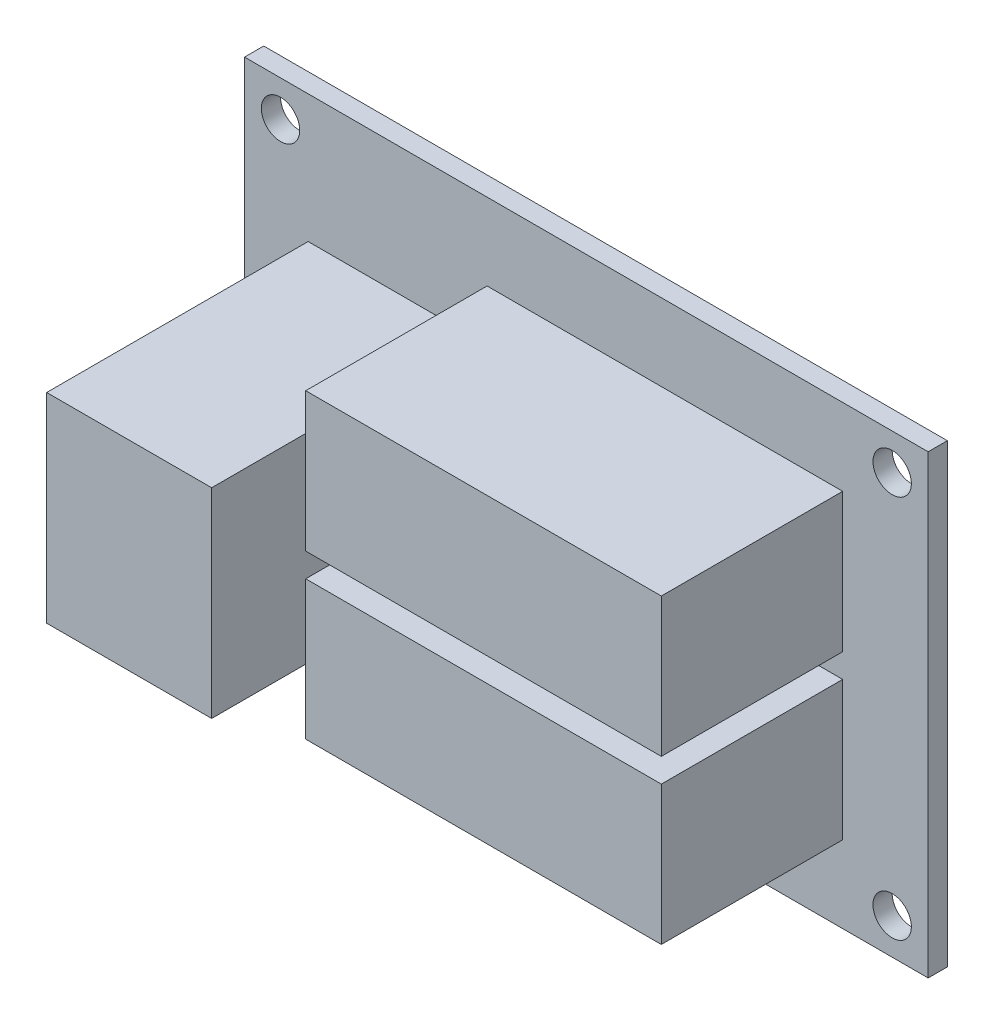
ISO-10303-21;
HEADER;
FILE_DESCRIPTION(('STEP AP214'),'2;1');
FILE_NAME('part.step','',(''),(''),'','','');
FILE_SCHEMA(('AUTOMOTIVE_DESIGN { 1 0 10303 214 1 1 1 1 }'));
ENDSEC;
DATA;
#1=APPLICATION_CONTEXT('core data for automotive mechanical design processes');
#2=APPLICATION_PROTOCOL_DEFINITION('international standard','automotive_design',2000,#1);
#3=PRODUCT_CONTEXT('',#1,'mechanical');
#4=PRODUCT('Part','Part','',(#3));
#5=PRODUCT_RELATED_PRODUCT_CATEGORY('part','',(#4));
#6=PRODUCT_DEFINITION_FORMATION('','',#4);
#7=PRODUCT_DEFINITION_CONTEXT('part definition',#1,'design');
#8=PRODUCT_DEFINITION('design','',#6,#7);
#9=PRODUCT_DEFINITION_SHAPE('','',#8);
#10=(LENGTH_UNIT() NAMED_UNIT(*) SI_UNIT(.MILLI.,.METRE.));
#11=(NAMED_UNIT(*) PLANE_ANGLE_UNIT() SI_UNIT($,.RADIAN.));
#12=(NAMED_UNIT(*) SI_UNIT($,.STERADIAN.) SOLID_ANGLE_UNIT());
#13=UNCERTAINTY_MEASURE_WITH_UNIT(LENGTH_MEASURE(1.E-05),#10,'distance_accuracy_value','');
#14=(GEOMETRIC_REPRESENTATION_CONTEXT(3) GLOBAL_UNCERTAINTY_ASSIGNED_CONTEXT((#13)) GLOBAL_UNIT_ASSIGNED_CONTEXT((#10,
#11,#12)) REPRESENTATION_CONTEXT('',''));
#15=CARTESIAN_POINT('',(0.,0.,0.));
#16=DIRECTION('',(0.,0.,1.));
#17=DIRECTION('',(1.,0.,0.));
#18=AXIS2_PLACEMENT_3D('',#15,#16,#17);
#19=CARTESIAN_POINT('',(0.,0.,1.6));
#20=DIRECTION('',(0.,0.,1.));
#21=DIRECTION('',(1.,0.,0.));
#22=AXIS2_PLACEMENT_3D('',#19,#20,#21);
#23=PLANE('',#22);
#24=CARTESIAN_POINT('',(-25.5,16.,1.6));
#25=DIRECTION('',(0.,0.,1.));
#26=DIRECTION('',(1.,0.,0.));
#27=AXIS2_PLACEMENT_3D('',#24,#25,#26);
#28=CIRCLE('',#27,1.6);
#29=CARTESIAN_POINT('',(-23.9,16.,1.6));
#30=VERTEX_POINT('',#29);
#31=EDGE_CURVE('E205',#30,#30,#28,.T.);
#32=ORIENTED_EDGE('',*,*,#31,.F.);
#33=EDGE_LOOP('',(#32));
#34=FACE_BOUND('',#33,.T.);
#35=CARTESIAN_POINT('',(-25.5,-16.,1.6));
#36=DIRECTION('',(0.,0.,1.));
#37=DIRECTION('',(1.,0.,0.));
#38=AXIS2_PLACEMENT_3D('',#35,#36,#37);
#39=CIRCLE('',#38,1.6);
#40=CARTESIAN_POINT('',(-23.9,-16.,1.6));
#41=VERTEX_POINT('',#40);
#42=EDGE_CURVE('E217',#41,#41,#39,.T.);
#43=ORIENTED_EDGE('',*,*,#42,.F.);
#44=EDGE_LOOP('',(#43));
#45=FACE_BOUND('',#44,.T.);
#46=DIRECTION('',(0.,1.,0.));
#47=VECTOR('',#46,1.);
#48=CARTESIAN_POINT('',(28.5,19.,1.6));
#49=LINE('',#48,#47);
#50=CARTESIAN_POINT('',(28.5,-19.,1.6));
#51=VERTEX_POINT('',#50);
#52=CARTESIAN_POINT('',(28.5,19.,1.6));
#53=VERTEX_POINT('',#52);
#54=EDGE_CURVE('E223',#51,#53,#49,.T.);
#55=ORIENTED_EDGE('',*,*,#54,.T.);
#56=DIRECTION('',(-1.,0.,0.));
#57=VECTOR('',#56,1.);
#58=CARTESIAN_POINT('',(-28.5,19.,1.6));
#59=LINE('',#58,#57);
#60=CARTESIAN_POINT('',(-28.5,19.,1.6));
#61=VERTEX_POINT('',#60);
#62=EDGE_CURVE('E226',#53,#61,#59,.T.);
#63=ORIENTED_EDGE('',*,*,#62,.T.);
#64=DIRECTION('',(0.,-1.,0.));
#65=VECTOR('',#64,1.);
#66=CARTESIAN_POINT('',(-28.5,19.,1.6));
#67=LINE('',#66,#65);
#68=CARTESIAN_POINT('',(-28.5,-19.,1.6));
#69=VERTEX_POINT('',#68);
#70=EDGE_CURVE('E229',#61,#69,#67,.T.);
#71=ORIENTED_EDGE('',*,*,#70,.T.);
#72=DIRECTION('',(1.,0.,0.));
#73=VECTOR('',#72,1.);
#74=CARTESIAN_POINT('',(-28.5,-19.,1.6));
#75=LINE('',#74,#73);
#76=EDGE_CURVE('E231',#69,#51,#75,.T.);
#77=ORIENTED_EDGE('',*,*,#76,.T.);
#78=EDGE_LOOP('',(#55,#63,#71,#77));
#79=FACE_BOUND('',#78,.T.);
#80=CARTESIAN_POINT('',(25.5,-16.,1.6));
#81=DIRECTION('',(0.,0.,1.));
#82=DIRECTION('',(1.,0.,0.));
#83=AXIS2_PLACEMENT_3D('',#80,#81,#82);
#84=CIRCLE('',#83,1.6);
#85=CARTESIAN_POINT('',(27.1,-16.,1.6));
#86=VERTEX_POINT('',#85);
#87=EDGE_CURVE('E211',#86,#86,#84,.T.);
#88=ORIENTED_EDGE('',*,*,#87,.F.);
#89=EDGE_LOOP('',(#88));
#90=FACE_BOUND('',#89,.T.);
#91=CARTESIAN_POINT('',(25.5,16.,1.6));
#92=DIRECTION('',(0.,0.,1.));
#93=DIRECTION('',(1.,0.,0.));
#94=AXIS2_PLACEMENT_3D('',#91,#92,#93);
#95=CIRCLE('',#94,1.6);
#96=CARTESIAN_POINT('',(27.1,16.,1.6));
#97=VERTEX_POINT('',#96);
#98=EDGE_CURVE('E197',#97,#97,#95,.T.);
#99=ORIENTED_EDGE('',*,*,#98,.F.);
#100=EDGE_LOOP('',(#99));
#101=FACE_BOUND('',#100,.T.);
#102=DIRECTION('',(1.,0.,0.));
#103=VECTOR('',#102,1.);
#104=CARTESIAN_POINT('',(21.374051794384,-12.5820715026048,1.6));
#105=LINE('',#104,#103);
#106=CARTESIAN_POINT('',(-8.27632162363964,-12.5820715026048,1.6));
#107=VERTEX_POINT('',#106);
#108=CARTESIAN_POINT('',(21.374051794384,-12.5820715026048,1.6));
#109=VERTEX_POINT('',#108);
#110=EDGE_CURVE('E193',#107,#109,#105,.T.);
#111=ORIENTED_EDGE('',*,*,#110,.F.);
#112=DIRECTION('',(0.,-1.,0.));
#113=VECTOR('',#112,1.);
#114=CARTESIAN_POINT('',(-8.27632162363964,-1.,1.6));
#115=LINE('',#114,#113);
#116=CARTESIAN_POINT('',(-8.27632162363964,-1.,1.6));
#117=VERTEX_POINT('',#116);
#118=EDGE_CURVE('E173',#117,#107,#115,.T.);
#119=ORIENTED_EDGE('',*,*,#118,.F.);
#120=DIRECTION('',(-1.,0.,0.));
#121=VECTOR('',#120,1.);
#122=CARTESIAN_POINT('',(21.374051794384,-1.,1.6));
#123=LINE('',#122,#121);
#124=CARTESIAN_POINT('',(21.374051794384,-1.,1.6));
#125=VERTEX_POINT('',#124);
#126=EDGE_CURVE('E187',#125,#117,#123,.T.);
#127=ORIENTED_EDGE('',*,*,#126,.F.);
#128=DIRECTION('',(0.,1.,0.));
#129=VECTOR('',#128,1.);
#130=CARTESIAN_POINT('',(21.374051794384,-1.,1.6));
#131=LINE('',#130,#129);
#132=EDGE_CURVE('E190',#109,#125,#131,.T.);
#133=ORIENTED_EDGE('',*,*,#132,.F.);
#134=EDGE_LOOP('',(#111,#119,#127,#133));
#135=FACE_BOUND('',#134,.T.);
#136=DIRECTION('',(1.,0.,0.));
#137=VECTOR('',#136,1.);
#138=CARTESIAN_POINT('',(21.374051794384,1.,1.6));
#139=LINE('',#138,#137);
#140=CARTESIAN_POINT('',(-8.27632162363964,1.,1.6));
#141=VERTEX_POINT('',#140);
#142=CARTESIAN_POINT('',(21.374051794384,1.,1.6));
#143=VERTEX_POINT('',#142);
#144=EDGE_CURVE('E285',#141,#143,#139,.T.);
#145=ORIENTED_EDGE('',*,*,#144,.F.);
#146=DIRECTION('',(0.,-1.,0.));
#147=VECTOR('',#146,1.);
#148=CARTESIAN_POINT('',(-8.27632162363964,12.5820715026048,1.6));
#149=LINE('',#148,#147);
#150=CARTESIAN_POINT('',(-8.27632162363964,12.5820715026048,1.6));
#151=VERTEX_POINT('',#150);
#152=EDGE_CURVE('E181',#151,#141,#149,.T.);
#153=ORIENTED_EDGE('',*,*,#152,.F.);
#154=DIRECTION('',(-1.,0.,0.));
#155=VECTOR('',#154,1.);
#156=CARTESIAN_POINT('',(21.374051794384,12.5820715026048,1.6));
#157=LINE('',#156,#155);
#158=CARTESIAN_POINT('',(21.374051794384,12.5820715026048,1.6));
#159=VERTEX_POINT('',#158);
#160=EDGE_CURVE('E322',#159,#151,#157,.T.);
#161=ORIENTED_EDGE('',*,*,#160,.F.);
#162=DIRECTION('',(0.,1.,0.));
#163=VECTOR('',#162,1.);
#164=CARTESIAN_POINT('',(21.374051794384,12.5820715026048,1.6));
#165=LINE('',#164,#163);
#166=EDGE_CURVE('E325',#143,#159,#165,.T.);
#167=ORIENTED_EDGE('',*,*,#166,.F.);
#168=EDGE_LOOP('',(#145,#153,#161,#167));
#169=FACE_BOUND('',#168,.T.);
#170=DIRECTION('',(-1.,0.,0.));
#171=VECTOR('',#170,1.);
#172=CARTESIAN_POINT('',(-23.1993644123557,8.33110830490331,1.6));
#173=LINE('',#172,#171);
#174=CARTESIAN_POINT('',(-9.44182928087719,8.33110830490331,1.6));
#175=VERTEX_POINT('',#174);
#176=CARTESIAN_POINT('',(-23.1993644123557,8.33110830490331,1.6));
#177=VERTEX_POINT('',#176);
#178=EDGE_CURVE('E289',#175,#177,#173,.T.);
#179=ORIENTED_EDGE('',*,*,#178,.F.);
#180=DIRECTION('',(0.,1.,0.));
#181=VECTOR('',#180,1.);
#182=CARTESIAN_POINT('',(-9.44182928087719,8.33110830490331,1.6));
#183=LINE('',#182,#181);
#184=CARTESIAN_POINT('',(-9.44182928087718,-8.3311083049033,1.6));
#185=VERTEX_POINT('',#184);
#186=EDGE_CURVE('E292',#185,#175,#183,.T.);
#187=ORIENTED_EDGE('',*,*,#186,.F.);
#188=DIRECTION('',(1.,0.,0.));
#189=VECTOR('',#188,1.);
#190=CARTESIAN_POINT('',(-23.1993644123557,-8.3311083049033,1.6));
#191=LINE('',#190,#189);
#192=CARTESIAN_POINT('',(-23.1993644123557,-8.3311083049033,1.6));
#193=VERTEX_POINT('',#192);
#194=EDGE_CURVE('E299',#193,#185,#191,.T.);
#195=ORIENTED_EDGE('',*,*,#194,.F.);
#196=DIRECTION('',(0.,-1.,0.));
#197=VECTOR('',#196,1.);
#198=CARTESIAN_POINT('',(-23.1993644123557,8.33110830490331,1.6));
#199=LINE('',#198,#197);
#200=EDGE_CURVE('E294',#177,#193,#199,.T.);
#201=ORIENTED_EDGE('',*,*,#200,.F.);
#202=EDGE_LOOP('',(#179,#187,#195,#201));
#203=FACE_BOUND('',#202,.T.);
#204=ADVANCED_FACE('F43',(#34,#45,#79,#90,#101,#135,#169,#203),#23,.T.);
#205=CARTESIAN_POINT('',(0.,0.,0.));
#206=DIRECTION('',(0.,0.,1.));
#207=DIRECTION('',(1.,0.,0.));
#208=AXIS2_PLACEMENT_3D('',#205,#206,#207);
#209=PLANE('',#208);
#210=DIRECTION('',(0.,1.,0.));
#211=VECTOR('',#210,1.);
#212=CARTESIAN_POINT('',(28.5,19.,0.));
#213=LINE('',#212,#211);
#214=CARTESIAN_POINT('',(28.5,-19.,0.));
#215=VERTEX_POINT('',#214);
#216=CARTESIAN_POINT('',(28.5,19.,0.));
#217=VERTEX_POINT('',#216);
#218=EDGE_CURVE('E220',#215,#217,#213,.T.);
#219=ORIENTED_EDGE('',*,*,#218,.F.);
#220=DIRECTION('',(1.,0.,0.));
#221=VECTOR('',#220,1.);
#222=CARTESIAN_POINT('',(-28.5,-19.,0.));
#223=LINE('',#222,#221);
#224=CARTESIAN_POINT('',(-28.5,-19.,0.));
#225=VERTEX_POINT('',#224);
#226=EDGE_CURVE('E227',#225,#215,#223,.T.);
#227=ORIENTED_EDGE('',*,*,#226,.F.);
#228=DIRECTION('',(0.,-1.,0.));
#229=VECTOR('',#228,1.);
#230=CARTESIAN_POINT('',(-28.5,19.,0.));
#231=LINE('',#230,#229);
#232=CARTESIAN_POINT('',(-28.5,19.,0.));
#233=VERTEX_POINT('',#232);
#234=EDGE_CURVE('E238',#233,#225,#231,.T.);
#235=ORIENTED_EDGE('',*,*,#234,.F.);
#236=DIRECTION('',(-1.,0.,0.));
#237=VECTOR('',#236,1.);
#238=CARTESIAN_POINT('',(-28.5,19.,0.));
#239=LINE('',#238,#237);
#240=EDGE_CURVE('E236',#217,#233,#239,.T.);
#241=ORIENTED_EDGE('',*,*,#240,.F.);
#242=EDGE_LOOP('',(#219,#227,#235,#241));
#243=FACE_BOUND('',#242,.T.);
#244=CARTESIAN_POINT('',(-25.5,-16.,0.));
#245=DIRECTION('',(0.,0.,1.));
#246=DIRECTION('',(1.,0.,0.));
#247=AXIS2_PLACEMENT_3D('',#244,#245,#246);
#248=CIRCLE('',#247,1.6);
#249=CARTESIAN_POINT('',(-23.9,-16.,0.));
#250=VERTEX_POINT('',#249);
#251=EDGE_CURVE('E214',#250,#250,#248,.T.);
#252=ORIENTED_EDGE('',*,*,#251,.T.);
#253=EDGE_LOOP('',(#252));
#254=FACE_BOUND('',#253,.T.);
#255=CARTESIAN_POINT('',(25.5,-16.,0.));
#256=DIRECTION('',(0.,0.,1.));
#257=DIRECTION('',(1.,0.,0.));
#258=AXIS2_PLACEMENT_3D('',#255,#256,#257);
#259=CIRCLE('',#258,1.6);
#260=CARTESIAN_POINT('',(27.1,-16.,0.));
#261=VERTEX_POINT('',#260);
#262=EDGE_CURVE('E208',#261,#261,#259,.T.);
#263=ORIENTED_EDGE('',*,*,#262,.T.);
#264=EDGE_LOOP('',(#263));
#265=FACE_BOUND('',#264,.T.);
#266=CARTESIAN_POINT('',(-25.5,16.,0.));
#267=DIRECTION('',(0.,0.,1.));
#268=DIRECTION('',(1.,0.,0.));
#269=AXIS2_PLACEMENT_3D('',#266,#267,#268);
#270=CIRCLE('',#269,1.6);
#271=CARTESIAN_POINT('',(-23.9,16.,0.));
#272=VERTEX_POINT('',#271);
#273=EDGE_CURVE('E200',#272,#272,#270,.T.);
#274=ORIENTED_EDGE('',*,*,#273,.T.);
#275=EDGE_LOOP('',(#274));
#276=FACE_BOUND('',#275,.T.);
#277=CARTESIAN_POINT('',(25.5,16.,0.));
#278=DIRECTION('',(0.,0.,1.));
#279=DIRECTION('',(1.,0.,0.));
#280=AXIS2_PLACEMENT_3D('',#277,#278,#279);
#281=CIRCLE('',#280,1.6);
#282=CARTESIAN_POINT('',(27.1,16.,0.));
#283=VERTEX_POINT('',#282);
#284=EDGE_CURVE('E201',#283,#283,#281,.T.);
#285=ORIENTED_EDGE('',*,*,#284,.T.);
#286=EDGE_LOOP('',(#285));
#287=FACE_BOUND('',#286,.T.);
#288=ADVANCED_FACE('F259',(#243,#254,#265,#276,#287),#209,.F.);
#289=CARTESIAN_POINT('',(28.5,19.,1.6));
#290=DIRECTION('',(-1.,0.,0.));
#291=DIRECTION('',(0.,-1.,0.));
#292=AXIS2_PLACEMENT_3D('',#289,#290,#291);
#293=PLANE('',#292);
#294=ORIENTED_EDGE('',*,*,#218,.T.);
#295=DIRECTION('',(0.,0.,-1.));
#296=VECTOR('',#295,1.);
#297=CARTESIAN_POINT('',(28.5,19.,1.6));
#298=LINE('',#297,#296);
#299=EDGE_CURVE('E51',#53,#217,#298,.T.);
#300=ORIENTED_EDGE('',*,*,#299,.F.);
#301=ORIENTED_EDGE('',*,*,#54,.F.);
#302=DIRECTION('',(0.,0.,-1.));
#303=VECTOR('',#302,1.);
#304=CARTESIAN_POINT('',(28.5,-19.,1.6));
#305=LINE('',#304,#303);
#306=EDGE_CURVE('E233',#51,#215,#305,.T.);
#307=ORIENTED_EDGE('',*,*,#306,.T.);
#308=EDGE_LOOP('',(#294,#300,#301,#307));
#309=FACE_BOUND('',#308,.T.);
#310=ADVANCED_FACE('F45',(#309),#293,.F.);
#311=CARTESIAN_POINT('',(-28.5,19.,1.6));
#312=DIRECTION('',(0.,-1.,0.));
#313=DIRECTION('',(0.,0.,-1.));
#314=AXIS2_PLACEMENT_3D('',#311,#312,#313);
#315=PLANE('',#314);
#316=ORIENTED_EDGE('',*,*,#240,.T.);
#317=DIRECTION('',(0.,0.,-1.));
#318=VECTOR('',#317,1.);
#319=CARTESIAN_POINT('',(-28.5,19.,1.6));
#320=LINE('',#319,#318);
#321=EDGE_CURVE('E246',#61,#233,#320,.T.);
#322=ORIENTED_EDGE('',*,*,#321,.F.);
#323=ORIENTED_EDGE('',*,*,#62,.F.);
#324=ORIENTED_EDGE('',*,*,#299,.T.);
#325=EDGE_LOOP('',(#316,#322,#323,#324));
#326=FACE_BOUND('',#325,.T.);
#327=ADVANCED_FACE('F251',(#326),#315,.F.);
#328=CARTESIAN_POINT('',(-28.5,19.,1.6));
#329=DIRECTION('',(1.,0.,0.));
#330=DIRECTION('',(0.,1.,0.));
#331=AXIS2_PLACEMENT_3D('',#328,#329,#330);
#332=PLANE('',#331);
#333=ORIENTED_EDGE('',*,*,#234,.T.);
#334=DIRECTION('',(0.,0.,-1.));
#335=VECTOR('',#334,1.);
#336=CARTESIAN_POINT('',(-28.5,-19.,1.6));
#337=LINE('',#336,#335);
#338=EDGE_CURVE('E243',#69,#225,#337,.T.);
#339=ORIENTED_EDGE('',*,*,#338,.F.);
#340=ORIENTED_EDGE('',*,*,#70,.F.);
#341=ORIENTED_EDGE('',*,*,#321,.T.);
#342=EDGE_LOOP('',(#333,#339,#340,#341));
#343=FACE_BOUND('',#342,.T.);
#344=ADVANCED_FACE('F264',(#343),#332,.F.);
#345=CARTESIAN_POINT('',(-28.5,-19.,1.6));
#346=DIRECTION('',(0.,1.,0.));
#347=DIRECTION('',(0.,0.,1.));
#348=AXIS2_PLACEMENT_3D('',#345,#346,#347);
#349=PLANE('',#348);
#350=ORIENTED_EDGE('',*,*,#226,.T.);
#351=ORIENTED_EDGE('',*,*,#306,.F.);
#352=ORIENTED_EDGE('',*,*,#76,.F.);
#353=ORIENTED_EDGE('',*,*,#338,.T.);
#354=EDGE_LOOP('',(#350,#351,#352,#353));
#355=FACE_BOUND('',#354,.T.);
#356=ADVANCED_FACE('F268',(#355),#349,.F.);
#357=CARTESIAN_POINT('',(-25.5,-16.,1.6));
#358=DIRECTION('',(0.,0.,-1.));
#359=DIRECTION('',(-1.,0.,0.));
#360=AXIS2_PLACEMENT_3D('',#357,#358,#359);
#361=CYLINDRICAL_SURFACE('',#360,1.6);
#362=ORIENTED_EDGE('',*,*,#42,.T.);
#363=EDGE_LOOP('',(#362));
#364=FACE_BOUND('',#363,.T.);
#365=ORIENTED_EDGE('',*,*,#251,.F.);
#366=EDGE_LOOP('',(#365));
#367=FACE_BOUND('',#366,.T.);
#368=ADVANCED_FACE('F409',(#364,#367),#361,.F.);
#369=CARTESIAN_POINT('',(25.5,-16.,1.6));
#370=DIRECTION('',(0.,0.,-1.));
#371=DIRECTION('',(-1.,0.,0.));
#372=AXIS2_PLACEMENT_3D('',#369,#370,#371);
#373=CYLINDRICAL_SURFACE('',#372,1.6);
#374=ORIENTED_EDGE('',*,*,#87,.T.);
#375=EDGE_LOOP('',(#374));
#376=FACE_BOUND('',#375,.T.);
#377=ORIENTED_EDGE('',*,*,#262,.F.);
#378=EDGE_LOOP('',(#377));
#379=FACE_BOUND('',#378,.T.);
#380=ADVANCED_FACE('F405',(#376,#379),#373,.F.);
#381=CARTESIAN_POINT('',(-25.5,16.,1.6));
#382=DIRECTION('',(0.,0.,-1.));
#383=DIRECTION('',(-1.,0.,0.));
#384=AXIS2_PLACEMENT_3D('',#381,#382,#383);
#385=CYLINDRICAL_SURFACE('',#384,1.6);
#386=ORIENTED_EDGE('',*,*,#31,.T.);
#387=EDGE_LOOP('',(#386));
#388=FACE_BOUND('',#387,.T.);
#389=ORIENTED_EDGE('',*,*,#273,.F.);
#390=EDGE_LOOP('',(#389));
#391=FACE_BOUND('',#390,.T.);
#392=ADVANCED_FACE('F401',(#388,#391),#385,.F.);
#393=CARTESIAN_POINT('',(25.5,16.,1.6));
#394=DIRECTION('',(0.,0.,-1.));
#395=DIRECTION('',(-1.,0.,0.));
#396=AXIS2_PLACEMENT_3D('',#393,#394,#395);
#397=CYLINDRICAL_SURFACE('',#396,1.6);
#398=ORIENTED_EDGE('',*,*,#98,.T.);
#399=EDGE_LOOP('',(#398));
#400=FACE_BOUND('',#399,.T.);
#401=ORIENTED_EDGE('',*,*,#284,.F.);
#402=EDGE_LOOP('',(#401));
#403=FACE_BOUND('',#402,.T.);
#404=ADVANCED_FACE('F389',(#400,#403),#397,.F.);
#405=CARTESIAN_POINT('',(-8.27632162363964,-1.,23.4));
#406=DIRECTION('',(1.,0.,0.));
#407=DIRECTION('',(0.,0.,-1.));
#408=AXIS2_PLACEMENT_3D('',#405,#406,#407);
#409=PLANE('',#408);
#410=DIRECTION('',(0.,0.,-1.));
#411=VECTOR('',#410,1.);
#412=CARTESIAN_POINT('',(-8.27632162363964,-12.5820715026048,23.4));
#413=LINE('',#412,#411);
#414=CARTESIAN_POINT('',(-8.27632162363964,-12.5820715026048,16.7229278254695));
#415=VERTEX_POINT('',#414);
#416=EDGE_CURVE('E167',#415,#107,#413,.T.);
#417=ORIENTED_EDGE('',*,*,#416,.F.);
#418=DIRECTION('',(0.,-1.,0.));
#419=VECTOR('',#418,1.);
#420=CARTESIAN_POINT('',(-8.27632162363964,19.,16.7229278254695));
#421=LINE('',#420,#419);
#422=CARTESIAN_POINT('',(-8.27632162363964,-1.,16.7229278254695));
#423=VERTEX_POINT('',#422);
#424=EDGE_CURVE('E153',#423,#415,#421,.T.);
#425=ORIENTED_EDGE('',*,*,#424,.F.);
#426=DIRECTION('',(0.,0.,-1.));
#427=VECTOR('',#426,1.);
#428=CARTESIAN_POINT('',(-8.27632162363964,-1.,23.4));
#429=LINE('',#428,#427);
#430=EDGE_CURVE('E185',#423,#117,#429,.T.);
#431=ORIENTED_EDGE('',*,*,#430,.T.);
#432=ORIENTED_EDGE('',*,*,#118,.T.);
#433=EDGE_LOOP('',(#417,#425,#431,#432));
#434=FACE_BOUND('',#433,.T.);
#435=ADVANCED_FACE('F171',(#434),#409,.F.);
#436=CARTESIAN_POINT('',(21.374051794384,-12.5820715026048,23.4));
#437=DIRECTION('',(0.,1.,0.));
#438=DIRECTION('',(-1.,0.,0.));
#439=AXIS2_PLACEMENT_3D('',#436,#437,#438);
#440=PLANE('',#439);
#441=DIRECTION('',(0.,0.,-1.));
#442=VECTOR('',#441,1.);
#443=CARTESIAN_POINT('',(21.374051794384,-12.5820715026048,23.4));
#444=LINE('',#443,#442);
#445=CARTESIAN_POINT('',(21.374051794384,-12.5820715026048,16.7229278254695));
#446=VERTEX_POINT('',#445);
#447=EDGE_CURVE('E169',#446,#109,#444,.T.);
#448=ORIENTED_EDGE('',*,*,#447,.F.);
#449=DIRECTION('',(1.,0.,0.));
#450=VECTOR('',#449,1.);
#451=CARTESIAN_POINT('',(-8.27632162363964,-12.5820715026048,16.7229278254695));
#452=LINE('',#451,#450);
#453=EDGE_CURVE('E156',#415,#446,#452,.T.);
#454=ORIENTED_EDGE('',*,*,#453,.F.);
#455=ORIENTED_EDGE('',*,*,#416,.T.);
#456=ORIENTED_EDGE('',*,*,#110,.T.);
#457=EDGE_LOOP('',(#448,#454,#455,#456));
#458=FACE_BOUND('',#457,.T.);
#459=ADVANCED_FACE('F165',(#458),#440,.F.);
#460=CARTESIAN_POINT('',(21.374051794384,-1.,23.4));
#461=DIRECTION('',(-1.,0.,0.));
#462=DIRECTION('',(0.,0.,1.));
#463=AXIS2_PLACEMENT_3D('',#460,#461,#462);
#464=PLANE('',#463);
#465=DIRECTION('',(0.,0.,-1.));
#466=VECTOR('',#465,1.);
#467=CARTESIAN_POINT('',(21.374051794384,-1.,23.4));
#468=LINE('',#467,#466);
#469=CARTESIAN_POINT('',(21.374051794384,-1.,16.7229278254695));
#470=VERTEX_POINT('',#469);
#471=EDGE_CURVE('E176',#470,#125,#468,.T.);
#472=ORIENTED_EDGE('',*,*,#471,.F.);
#473=DIRECTION('',(0.,-1.,0.));
#474=VECTOR('',#473,1.);
#475=CARTESIAN_POINT('',(21.374051794384,19.,16.7229278254695));
#476=LINE('',#475,#474);
#477=EDGE_CURVE('E58',#470,#446,#476,.T.);
#478=ORIENTED_EDGE('',*,*,#477,.T.);
#479=ORIENTED_EDGE('',*,*,#447,.T.);
#480=ORIENTED_EDGE('',*,*,#132,.T.);
#481=EDGE_LOOP('',(#472,#478,#479,#480));
#482=FACE_BOUND('',#481,.T.);
#483=ADVANCED_FACE('F392',(#482),#464,.F.);
#484=CARTESIAN_POINT('',(21.374051794384,-1.,23.4));
#485=DIRECTION('',(0.,-1.,0.));
#486=DIRECTION('',(0.,0.,-1.));
#487=AXIS2_PLACEMENT_3D('',#484,#485,#486);
#488=PLANE('',#487);
#489=ORIENTED_EDGE('',*,*,#430,.F.);
#490=DIRECTION('',(1.,0.,0.));
#491=VECTOR('',#490,1.);
#492=CARTESIAN_POINT('',(21.374051794384,-1.,16.7229278254695));
#493=LINE('',#492,#491);
#494=EDGE_CURVE('E157',#423,#470,#493,.T.);
#495=ORIENTED_EDGE('',*,*,#494,.T.);
#496=ORIENTED_EDGE('',*,*,#471,.T.);
#497=ORIENTED_EDGE('',*,*,#126,.T.);
#498=EDGE_LOOP('',(#489,#495,#496,#497));
#499=FACE_BOUND('',#498,.T.);
#500=ADVANCED_FACE('F380',(#499),#488,.F.);
#501=CARTESIAN_POINT('',(-8.27632162363964,12.5820715026048,23.4));
#502=DIRECTION('',(1.,0.,0.));
#503=DIRECTION('',(0.,0.,-1.));
#504=AXIS2_PLACEMENT_3D('',#501,#502,#503);
#505=PLANE('',#504);
#506=DIRECTION('',(0.,0.,-1.));
#507=VECTOR('',#506,1.);
#508=CARTESIAN_POINT('',(-8.27632162363964,1.,23.4));
#509=LINE('',#508,#507);
#510=CARTESIAN_POINT('',(-8.27632162363964,1.,16.7229278254695));
#511=VERTEX_POINT('',#510);
#512=EDGE_CURVE('E196',#511,#141,#509,.T.);
#513=ORIENTED_EDGE('',*,*,#512,.F.);
#514=CARTESIAN_POINT('',(-8.27632162363964,12.5820715026048,16.7229278254695));
#515=VERTEX_POINT('',#514);
#516=EDGE_CURVE('E161',#515,#511,#421,.T.);
#517=ORIENTED_EDGE('',*,*,#516,.F.);
#518=DIRECTION('',(0.,0.,-1.));
#519=VECTOR('',#518,1.);
#520=CARTESIAN_POINT('',(-8.27632162363964,12.5820715026048,23.4));
#521=LINE('',#520,#519);
#522=EDGE_CURVE('E320',#515,#151,#521,.T.);
#523=ORIENTED_EDGE('',*,*,#522,.T.);
#524=ORIENTED_EDGE('',*,*,#152,.T.);
#525=EDGE_LOOP('',(#513,#517,#523,#524));
#526=FACE_BOUND('',#525,.T.);
#527=ADVANCED_FACE('F332',(#526),#505,.F.);
#528=CARTESIAN_POINT('',(21.374051794384,1.,23.4));
#529=DIRECTION('',(0.,1.,0.));
#530=DIRECTION('',(0.,0.,1.));
#531=AXIS2_PLACEMENT_3D('',#528,#529,#530);
#532=PLANE('',#531);
#533=DIRECTION('',(0.,0.,-1.));
#534=VECTOR('',#533,1.);
#535=CARTESIAN_POINT('',(21.374051794384,1.,23.4));
#536=LINE('',#535,#534);
#537=CARTESIAN_POINT('',(21.374051794384,1.,16.7229278254695));
#538=VERTEX_POINT('',#537);
#539=EDGE_CURVE('E316',#538,#143,#536,.T.);
#540=ORIENTED_EDGE('',*,*,#539,.F.);
#541=DIRECTION('',(-1.,0.,0.));
#542=VECTOR('',#541,1.);
#543=CARTESIAN_POINT('',(21.374051794384,1.,16.7229278254695));
#544=LINE('',#543,#542);
#545=EDGE_CURVE('E178',#538,#511,#544,.T.);
#546=ORIENTED_EDGE('',*,*,#545,.T.);
#547=ORIENTED_EDGE('',*,*,#512,.T.);
#548=ORIENTED_EDGE('',*,*,#144,.T.);
#549=EDGE_LOOP('',(#540,#546,#547,#548));
#550=FACE_BOUND('',#549,.T.);
#551=ADVANCED_FACE('F342',(#550),#532,.F.);
#552=CARTESIAN_POINT('',(21.374051794384,12.5820715026048,23.4));
#553=DIRECTION('',(-1.,0.,0.));
#554=DIRECTION('',(0.,0.,1.));
#555=AXIS2_PLACEMENT_3D('',#552,#553,#554);
#556=PLANE('',#555);
#557=DIRECTION('',(0.,0.,-1.));
#558=VECTOR('',#557,1.);
#559=CARTESIAN_POINT('',(21.374051794384,12.5820715026048,23.4));
#560=LINE('',#559,#558);
#561=CARTESIAN_POINT('',(21.374051794384,12.5820715026048,16.7229278254695));
#562=VERTEX_POINT('',#561);
#563=EDGE_CURVE('E318',#562,#159,#560,.T.);
#564=ORIENTED_EDGE('',*,*,#563,.F.);
#565=EDGE_CURVE('E66',#562,#538,#476,.T.);
#566=ORIENTED_EDGE('',*,*,#565,.T.);
#567=ORIENTED_EDGE('',*,*,#539,.T.);
#568=ORIENTED_EDGE('',*,*,#166,.T.);
#569=EDGE_LOOP('',(#564,#566,#567,#568));
#570=FACE_BOUND('',#569,.T.);
#571=ADVANCED_FACE('F340',(#570),#556,.F.);
#572=CARTESIAN_POINT('',(21.374051794384,12.5820715026048,23.4));
#573=DIRECTION('',(0.,-1.,0.));
#574=DIRECTION('',(1.,0.,0.));
#575=AXIS2_PLACEMENT_3D('',#572,#573,#574);
#576=PLANE('',#575);
#577=ORIENTED_EDGE('',*,*,#522,.F.);
#578=DIRECTION('',(1.,0.,0.));
#579=VECTOR('',#578,1.);
#580=CARTESIAN_POINT('',(21.374051794384,12.5820715026048,16.7229278254695));
#581=LINE('',#580,#579);
#582=EDGE_CURVE('E11',#515,#562,#581,.T.);
#583=ORIENTED_EDGE('',*,*,#582,.T.);
#584=ORIENTED_EDGE('',*,*,#563,.T.);
#585=ORIENTED_EDGE('',*,*,#160,.T.);
#586=EDGE_LOOP('',(#577,#583,#584,#585));
#587=FACE_BOUND('',#586,.T.);
#588=ADVANCED_FACE('F337',(#587),#576,.F.);
#589=CARTESIAN_POINT('',(-9.44182928087719,8.33110830490331,23.4));
#590=DIRECTION('',(-1.,0.,0.));
#591=DIRECTION('',(0.,-1.,0.));
#592=AXIS2_PLACEMENT_3D('',#589,#590,#591);
#593=PLANE('',#592);
#594=ORIENTED_EDGE('',*,*,#186,.T.);
#595=DIRECTION('',(0.,0.,-1.));
#596=VECTOR('',#595,1.);
#597=CARTESIAN_POINT('',(-9.44182928087719,8.33110830490331,23.4));
#598=LINE('',#597,#596);
#599=CARTESIAN_POINT('',(-9.44182928087719,8.33110830490331,23.4));
#600=VERTEX_POINT('',#599);
#601=EDGE_CURVE('E204',#600,#175,#598,.T.);
#602=ORIENTED_EDGE('',*,*,#601,.F.);
#603=DIRECTION('',(0.,1.,0.));
#604=VECTOR('',#603,1.);
#605=CARTESIAN_POINT('',(-9.44182928087719,8.33110830490331,23.4));
#606=LINE('',#605,#604);
#607=CARTESIAN_POINT('',(-9.44182928087718,-8.3311083049033,23.4));
#608=VERTEX_POINT('',#607);
#609=EDGE_CURVE('E305',#608,#600,#606,.T.);
#610=ORIENTED_EDGE('',*,*,#609,.F.);
#611=DIRECTION('',(0.,0.,-1.));
#612=VECTOR('',#611,1.);
#613=CARTESIAN_POINT('',(-9.44182928087718,-8.3311083049033,23.4));
#614=LINE('',#613,#612);
#615=EDGE_CURVE('E306',#608,#185,#614,.T.);
#616=ORIENTED_EDGE('',*,*,#615,.T.);
#617=EDGE_LOOP('',(#594,#602,#610,#616));
#618=FACE_BOUND('',#617,.T.);
#619=ADVANCED_FACE('F362',(#618),#593,.F.);
#620=CARTESIAN_POINT('',(-23.1993644123557,8.33110830490331,23.4));
#621=DIRECTION('',(0.,-1.,0.));
#622=DIRECTION('',(0.,0.,-1.));
#623=AXIS2_PLACEMENT_3D('',#620,#621,#622);
#624=PLANE('',#623);
#625=ORIENTED_EDGE('',*,*,#178,.T.);
#626=DIRECTION('',(0.,0.,-1.));
#627=VECTOR('',#626,1.);
#628=CARTESIAN_POINT('',(-23.1993644123557,8.33110830490331,23.4));
#629=LINE('',#628,#627);
#630=CARTESIAN_POINT('',(-23.1993644123557,8.33110830490331,23.4));
#631=VERTEX_POINT('',#630);
#632=EDGE_CURVE('E312',#631,#177,#629,.T.);
#633=ORIENTED_EDGE('',*,*,#632,.F.);
#634=DIRECTION('',(-1.,0.,0.));
#635=VECTOR('',#634,1.);
#636=CARTESIAN_POINT('',(-23.1993644123557,8.33110830490331,23.4));
#637=LINE('',#636,#635);
#638=EDGE_CURVE('E348',#600,#631,#637,.T.);
#639=ORIENTED_EDGE('',*,*,#638,.F.);
#640=ORIENTED_EDGE('',*,*,#601,.T.);
#641=EDGE_LOOP('',(#625,#633,#639,#640));
#642=FACE_BOUND('',#641,.T.);
#643=ADVANCED_FACE('F363',(#642),#624,.F.);
#644=CARTESIAN_POINT('',(-23.1993644123557,8.33110830490331,23.4));
#645=DIRECTION('',(1.,0.,0.));
#646=DIRECTION('',(0.,0.,-1.));
#647=AXIS2_PLACEMENT_3D('',#644,#645,#646);
#648=PLANE('',#647);
#649=ORIENTED_EDGE('',*,*,#200,.T.);
#650=DIRECTION('',(0.,0.,-1.));
#651=VECTOR('',#650,1.);
#652=CARTESIAN_POINT('',(-23.1993644123557,-8.3311083049033,23.4));
#653=LINE('',#652,#651);
#654=CARTESIAN_POINT('',(-23.1993644123557,-8.3311083049033,23.4));
#655=VERTEX_POINT('',#654);
#656=EDGE_CURVE('E309',#655,#193,#653,.T.);
#657=ORIENTED_EDGE('',*,*,#656,.F.);
#658=DIRECTION('',(0.,-1.,0.));
#659=VECTOR('',#658,1.);
#660=CARTESIAN_POINT('',(-23.1993644123557,8.33110830490331,23.4));
#661=LINE('',#660,#659);
#662=EDGE_CURVE('E350',#631,#655,#661,.T.);
#663=ORIENTED_EDGE('',*,*,#662,.F.);
#664=ORIENTED_EDGE('',*,*,#632,.T.);
#665=EDGE_LOOP('',(#649,#657,#663,#664));
#666=FACE_BOUND('',#665,.T.);
#667=ADVANCED_FACE('F365',(#666),#648,.F.);
#668=CARTESIAN_POINT('',(-23.1993644123557,-8.3311083049033,23.4));
#669=DIRECTION('',(0.,1.,0.));
#670=DIRECTION('',(0.,0.,1.));
#671=AXIS2_PLACEMENT_3D('',#668,#669,#670);
#672=PLANE('',#671);
#673=ORIENTED_EDGE('',*,*,#194,.T.);
#674=ORIENTED_EDGE('',*,*,#615,.F.);
#675=DIRECTION('',(1.,0.,0.));
#676=VECTOR('',#675,1.);
#677=CARTESIAN_POINT('',(-23.1993644123557,-8.3311083049033,23.4));
#678=LINE('',#677,#676);
#679=EDGE_CURVE('E310',#655,#608,#678,.T.);
#680=ORIENTED_EDGE('',*,*,#679,.F.);
#681=ORIENTED_EDGE('',*,*,#656,.T.);
#682=EDGE_LOOP('',(#673,#674,#680,#681));
#683=FACE_BOUND('',#682,.T.);
#684=ADVANCED_FACE('F360',(#683),#672,.F.);
#685=CARTESIAN_POINT('',(0.,0.,23.4));
#686=DIRECTION('',(0.,0.,1.));
#687=DIRECTION('',(1.,0.,0.));
#688=AXIS2_PLACEMENT_3D('',#685,#686,#687);
#689=PLANE('',#688);
#690=ORIENTED_EDGE('',*,*,#609,.T.);
#691=ORIENTED_EDGE('',*,*,#638,.T.);
#692=ORIENTED_EDGE('',*,*,#662,.T.);
#693=ORIENTED_EDGE('',*,*,#679,.T.);
#694=EDGE_LOOP('',(#690,#691,#692,#693));
#695=FACE_BOUND('',#694,.T.);
#696=ADVANCED_FACE('F354',(#695),#689,.T.);
#697=CARTESIAN_POINT('',(-8.27632162363964,19.,16.7229278254695));
#698=DIRECTION('',(0.,0.,-1.));
#699=DIRECTION('',(-1.,0.,0.));
#700=AXIS2_PLACEMENT_3D('',#697,#698,#699);
#701=PLANE('',#700);
#702=ORIENTED_EDGE('',*,*,#565,.F.);
#703=ORIENTED_EDGE('',*,*,#582,.F.);
#704=ORIENTED_EDGE('',*,*,#516,.T.);
#705=ORIENTED_EDGE('',*,*,#545,.F.);
#706=EDGE_LOOP('',(#702,#703,#704,#705));
#707=FACE_BOUND('',#706,.T.);
#708=ADVANCED_FACE('F474',(#707),#701,.F.);
#709=ORIENTED_EDGE('',*,*,#424,.T.);
#710=ORIENTED_EDGE('',*,*,#453,.T.);
#711=ORIENTED_EDGE('',*,*,#477,.F.);
#712=ORIENTED_EDGE('',*,*,#494,.F.);
#713=EDGE_LOOP('',(#709,#710,#711,#712));
#714=FACE_BOUND('',#713,.T.);
#715=ADVANCED_FACE('F155',(#714),#701,.F.);
#716=CLOSED_SHELL('',(#204,#288,#310,#327,#344,#356,#368,#380,#392,#404,#435,#459,#483,#500,
#527,#551,#571,#588,#619,#643,#667,#684,#696,#708,#715));
#717=MANIFOLD_SOLID_BREP('B2',#716);
#718=ADVANCED_BREP_SHAPE_REPRESENTATION('',(#18,#717),#14);
#719=SHAPE_DEFINITION_REPRESENTATION(#9,#718);
ENDSEC;
END-ISO-10303-21;
